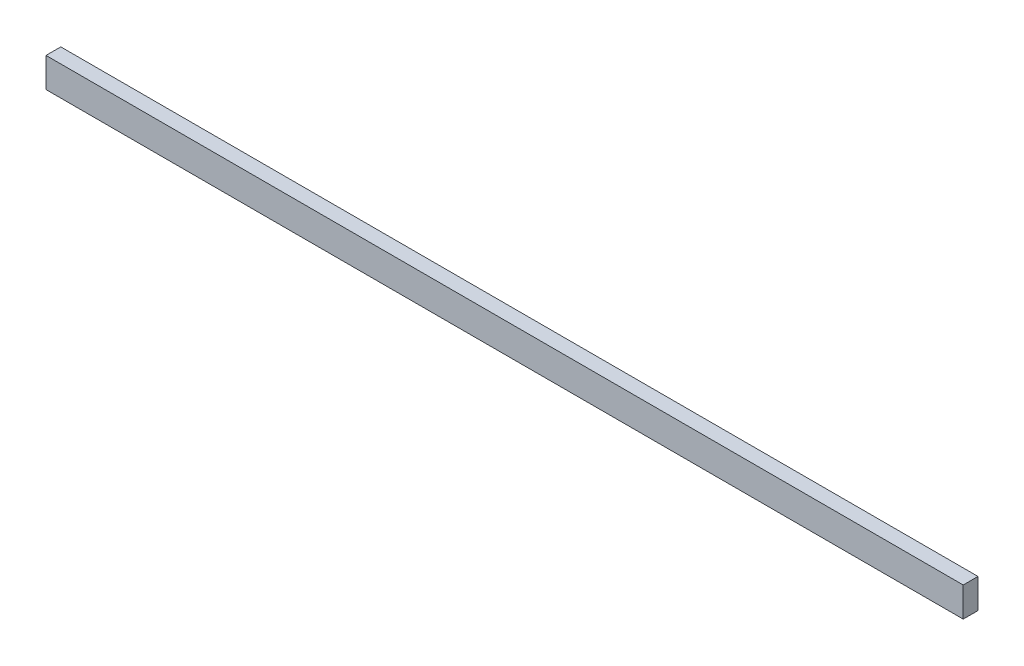
ISO-10303-21;
HEADER;
FILE_DESCRIPTION(('STEP AP214'),'2;1');
FILE_NAME('part.step','',(''),(''),'','','');
FILE_SCHEMA(('AUTOMOTIVE_DESIGN { 1 0 10303 214 1 1 1 1 }'));
ENDSEC;
DATA;
#1=APPLICATION_CONTEXT('core data for automotive mechanical design processes');
#2=APPLICATION_PROTOCOL_DEFINITION('international standard','automotive_design',2000,#1);
#3=PRODUCT_CONTEXT('',#1,'mechanical');
#4=PRODUCT('Part','Part','',(#3));
#5=PRODUCT_RELATED_PRODUCT_CATEGORY('part','',(#4));
#6=PRODUCT_DEFINITION_FORMATION('','',#4);
#7=PRODUCT_DEFINITION_CONTEXT('part definition',#1,'design');
#8=PRODUCT_DEFINITION('design','',#6,#7);
#9=PRODUCT_DEFINITION_SHAPE('','',#8);
#10=(LENGTH_UNIT() NAMED_UNIT(*) SI_UNIT(.MILLI.,.METRE.));
#11=(NAMED_UNIT(*) PLANE_ANGLE_UNIT() SI_UNIT($,.RADIAN.));
#12=(NAMED_UNIT(*) SI_UNIT($,.STERADIAN.) SOLID_ANGLE_UNIT());
#13=UNCERTAINTY_MEASURE_WITH_UNIT(LENGTH_MEASURE(1.E-05),#10,'distance_accuracy_value','');
#14=(GEOMETRIC_REPRESENTATION_CONTEXT(3) GLOBAL_UNCERTAINTY_ASSIGNED_CONTEXT((#13)) GLOBAL_UNIT_ASSIGNED_CONTEXT((#10,
#11,#12)) REPRESENTATION_CONTEXT('',''));
#15=CARTESIAN_POINT('',(0.,0.,0.));
#16=DIRECTION('',(0.,0.,1.));
#17=DIRECTION('',(1.,0.,0.));
#18=AXIS2_PLACEMENT_3D('',#15,#16,#17);
#19=CARTESIAN_POINT('',(-590.55,19.05,-584.2));
#20=DIRECTION('',(0.,0.,1.));
#21=DIRECTION('',(1.,0.,0.));
#22=AXIS2_PLACEMENT_3D('',#19,#20,#21);
#23=PLANE('',#22);
#24=DIRECTION('',(0.,1.,0.));
#25=VECTOR('',#24,1.);
#26=CARTESIAN_POINT('',(-590.55,19.05,-584.2));
#27=LINE('',#26,#25);
#28=CARTESIAN_POINT('',(-590.55,19.05,-584.2));
#29=VERTEX_POINT('',#28);
#30=CARTESIAN_POINT('',(-590.55,57.15,-584.2));
#31=VERTEX_POINT('',#30);
#32=EDGE_CURVE('E19',#29,#31,#27,.T.);
#33=ORIENTED_EDGE('',*,*,#32,.F.);
#34=DIRECTION('',(1.,0.,0.));
#35=VECTOR('',#34,1.);
#36=CARTESIAN_POINT('',(0.,19.05,-584.2));
#37=LINE('',#36,#35);
#38=CARTESIAN_POINT('',(590.55,19.05,-584.2));
#39=VERTEX_POINT('',#38);
#40=EDGE_CURVE('E79',#29,#39,#37,.T.);
#41=ORIENTED_EDGE('',*,*,#40,.T.);
#42=DIRECTION('',(0.,1.,0.));
#43=VECTOR('',#42,1.);
#44=CARTESIAN_POINT('',(590.55,19.05,-584.2));
#45=LINE('',#44,#43);
#46=CARTESIAN_POINT('',(590.55,57.15,-584.2));
#47=VERTEX_POINT('',#46);
#48=EDGE_CURVE('E60',#47,#39,#45,.F.);
#49=ORIENTED_EDGE('',*,*,#48,.F.);
#50=DIRECTION('',(1.,0.,0.));
#51=VECTOR('',#50,1.);
#52=CARTESIAN_POINT('',(0.,57.15,-584.2));
#53=LINE('',#52,#51);
#54=EDGE_CURVE('E55',#31,#47,#53,.T.);
#55=ORIENTED_EDGE('',*,*,#54,.F.);
#56=EDGE_LOOP('',(#33,#41,#49,#55));
#57=FACE_BOUND('',#56,.T.);
#58=ADVANCED_FACE('F16',(#57),#23,.T.);
#59=CARTESIAN_POINT('',(-590.55,19.05,-603.25));
#60=DIRECTION('',(-1.,0.,0.));
#61=DIRECTION('',(0.,0.,1.));
#62=AXIS2_PLACEMENT_3D('',#59,#60,#61);
#63=PLANE('',#62);
#64=DIRECTION('',(0.,1.,0.));
#65=VECTOR('',#64,1.);
#66=CARTESIAN_POINT('',(-590.55,19.05,-603.25));
#67=LINE('',#66,#65);
#68=CARTESIAN_POINT('',(-590.55,19.05,-603.25));
#69=VERTEX_POINT('',#68);
#70=CARTESIAN_POINT('',(-590.55,57.15,-603.25));
#71=VERTEX_POINT('',#70);
#72=EDGE_CURVE('E82',#69,#71,#67,.T.);
#73=ORIENTED_EDGE('',*,*,#72,.F.);
#74=DIRECTION('',(0.,0.,1.));
#75=VECTOR('',#74,1.);
#76=CARTESIAN_POINT('',(-590.55,19.05,0.));
#77=LINE('',#76,#75);
#78=EDGE_CURVE('E67',#69,#29,#77,.T.);
#79=ORIENTED_EDGE('',*,*,#78,.T.);
#80=ORIENTED_EDGE('',*,*,#32,.T.);
#81=DIRECTION('',(0.,0.,1.));
#82=VECTOR('',#81,1.);
#83=CARTESIAN_POINT('',(-590.55,57.15,0.));
#84=LINE('',#83,#82);
#85=EDGE_CURVE('E62',#71,#31,#84,.T.);
#86=ORIENTED_EDGE('',*,*,#85,.F.);
#87=EDGE_LOOP('',(#73,#79,#80,#86));
#88=FACE_BOUND('',#87,.T.);
#89=ADVANCED_FACE('F64',(#88),#63,.T.);
#90=CARTESIAN_POINT('',(0.,57.15,0.));
#91=DIRECTION('',(0.,1.,0.));
#92=DIRECTION('',(0.,0.,1.));
#93=AXIS2_PLACEMENT_3D('',#90,#91,#92);
#94=PLANE('',#93);
#95=DIRECTION('',(-1.,0.,0.));
#96=VECTOR('',#95,1.);
#97=CARTESIAN_POINT('',(590.55,57.15,-603.25));
#98=LINE('',#97,#96);
#99=CARTESIAN_POINT('',(590.55,57.15,-603.25));
#100=VERTEX_POINT('',#99);
#101=EDGE_CURVE('E71',#71,#100,#98,.F.);
#102=ORIENTED_EDGE('',*,*,#101,.F.);
#103=ORIENTED_EDGE('',*,*,#85,.T.);
#104=ORIENTED_EDGE('',*,*,#54,.T.);
#105=DIRECTION('',(0.,0.,-1.));
#106=VECTOR('',#105,1.);
#107=CARTESIAN_POINT('',(590.55,57.15,-584.2));
#108=LINE('',#107,#106);
#109=EDGE_CURVE('E73',#100,#47,#108,.F.);
#110=ORIENTED_EDGE('',*,*,#109,.F.);
#111=EDGE_LOOP('',(#102,#103,#104,#110));
#112=FACE_BOUND('',#111,.T.);
#113=ADVANCED_FACE('F69',(#112),#94,.T.);
#114=CARTESIAN_POINT('',(590.55,19.05,-584.2));
#115=DIRECTION('',(1.,0.,0.));
#116=DIRECTION('',(0.,0.,-1.));
#117=AXIS2_PLACEMENT_3D('',#114,#115,#116);
#118=PLANE('',#117);
#119=ORIENTED_EDGE('',*,*,#48,.T.);
#120=DIRECTION('',(0.,0.,1.));
#121=VECTOR('',#120,1.);
#122=CARTESIAN_POINT('',(590.55,19.05,0.));
#123=LINE('',#122,#121);
#124=CARTESIAN_POINT('',(590.55,19.05,-603.25));
#125=VERTEX_POINT('',#124);
#126=EDGE_CURVE('E34',#39,#125,#123,.F.);
#127=ORIENTED_EDGE('',*,*,#126,.T.);
#128=DIRECTION('',(0.,1.,0.));
#129=VECTOR('',#128,1.);
#130=CARTESIAN_POINT('',(590.55,19.05,-603.25));
#131=LINE('',#130,#129);
#132=EDGE_CURVE('E25',#100,#125,#131,.F.);
#133=ORIENTED_EDGE('',*,*,#132,.F.);
#134=ORIENTED_EDGE('',*,*,#109,.T.);
#135=EDGE_LOOP('',(#119,#127,#133,#134));
#136=FACE_BOUND('',#135,.T.);
#137=ADVANCED_FACE('F88',(#136),#118,.T.);
#138=CARTESIAN_POINT('',(0.,19.05,0.));
#139=DIRECTION('',(0.,1.,0.));
#140=DIRECTION('',(0.,0.,1.));
#141=AXIS2_PLACEMENT_3D('',#138,#139,#140);
#142=PLANE('',#141);
#143=ORIENTED_EDGE('',*,*,#126,.F.);
#144=ORIENTED_EDGE('',*,*,#40,.F.);
#145=ORIENTED_EDGE('',*,*,#78,.F.);
#146=DIRECTION('',(-1.,0.,0.));
#147=VECTOR('',#146,1.);
#148=CARTESIAN_POINT('',(590.55,19.05,-603.25));
#149=LINE('',#148,#147);
#150=EDGE_CURVE('E11',#125,#69,#149,.T.);
#151=ORIENTED_EDGE('',*,*,#150,.F.);
#152=EDGE_LOOP('',(#143,#144,#145,#151));
#153=FACE_BOUND('',#152,.T.);
#154=ADVANCED_FACE('F90',(#153),#142,.F.);
#155=CARTESIAN_POINT('',(590.55,19.05,-603.25));
#156=DIRECTION('',(0.,0.,-1.));
#157=DIRECTION('',(-1.,0.,0.));
#158=AXIS2_PLACEMENT_3D('',#155,#156,#157);
#159=PLANE('',#158);
#160=ORIENTED_EDGE('',*,*,#132,.T.);
#161=ORIENTED_EDGE('',*,*,#150,.T.);
#162=ORIENTED_EDGE('',*,*,#72,.T.);
#163=ORIENTED_EDGE('',*,*,#101,.T.);
#164=EDGE_LOOP('',(#160,#161,#162,#163));
#165=FACE_BOUND('',#164,.T.);
#166=ADVANCED_FACE('F87',(#165),#159,.T.);
#167=CLOSED_SHELL('',(#58,#89,#113,#137,#154,#166));
#168=MANIFOLD_SOLID_BREP('B1',#167);
#169=ADVANCED_BREP_SHAPE_REPRESENTATION('',(#18,#168),#14);
#170=SHAPE_DEFINITION_REPRESENTATION(#9,#169);
ENDSEC;
END-ISO-10303-21;
